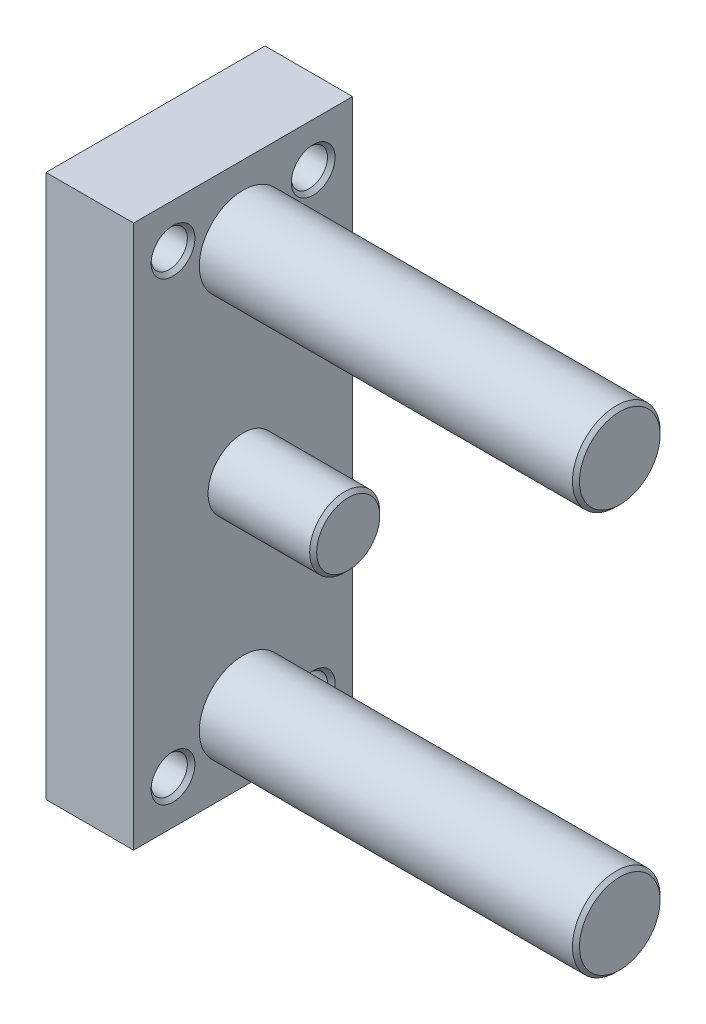
ISO-10303-21;
HEADER;
FILE_DESCRIPTION(('STEP AP214'),'2;1');
FILE_NAME('part.step','',(''),(''),'','','');
FILE_SCHEMA(('AUTOMOTIVE_DESIGN { 1 0 10303 214 1 1 1 1 }'));
ENDSEC;
DATA;
#1=APPLICATION_CONTEXT('core data for automotive mechanical design processes');
#2=APPLICATION_PROTOCOL_DEFINITION('international standard','automotive_design',2000,#1);
#3=PRODUCT_CONTEXT('',#1,'mechanical');
#4=PRODUCT('Part','Part','',(#3));
#5=PRODUCT_RELATED_PRODUCT_CATEGORY('part','',(#4));
#6=PRODUCT_DEFINITION_FORMATION('','',#4);
#7=PRODUCT_DEFINITION_CONTEXT('part definition',#1,'design');
#8=PRODUCT_DEFINITION('design','',#6,#7);
#9=PRODUCT_DEFINITION_SHAPE('','',#8);
#10=(LENGTH_UNIT() NAMED_UNIT(*) SI_UNIT(.MILLI.,.METRE.));
#11=(NAMED_UNIT(*) PLANE_ANGLE_UNIT() SI_UNIT($,.RADIAN.));
#12=(NAMED_UNIT(*) SI_UNIT($,.STERADIAN.) SOLID_ANGLE_UNIT());
#13=UNCERTAINTY_MEASURE_WITH_UNIT(LENGTH_MEASURE(1.E-05),#10,'distance_accuracy_value','');
#14=(GEOMETRIC_REPRESENTATION_CONTEXT(3) GLOBAL_UNCERTAINTY_ASSIGNED_CONTEXT((#13)) GLOBAL_UNIT_ASSIGNED_CONTEXT((#10,
#11,#12)) REPRESENTATION_CONTEXT('',''));
#15=CARTESIAN_POINT('',(0.,0.,0.));
#16=DIRECTION('',(0.,0.,1.));
#17=DIRECTION('',(1.,0.,0.));
#18=AXIS2_PLACEMENT_3D('',#15,#16,#17);
#19=CARTESIAN_POINT('',(10.,0.,0.));
#20=DIRECTION('',(1.,0.,0.));
#21=DIRECTION('',(0.,0.,-1.));
#22=AXIS2_PLACEMENT_3D('',#19,#20,#21);
#23=PLANE('',#22);
#24=CARTESIAN_POINT('',(10.,-23.,0.));
#25=DIRECTION('',(-1.,0.,0.));
#26=DIRECTION('',(0.,0.,1.));
#27=AXIS2_PLACEMENT_3D('',#24,#25,#26);
#28=CIRCLE('',#27,5.);
#29=CARTESIAN_POINT('',(10.,-23.,5.));
#30=VERTEX_POINT('',#29);
#31=EDGE_CURVE('E201',#30,#30,#28,.T.);
#32=ORIENTED_EDGE('',*,*,#31,.T.);
#33=EDGE_LOOP('',(#32));
#34=FACE_BOUND('',#33,.T.);
#35=CARTESIAN_POINT('',(10.,-26.,8.));
#36=DIRECTION('',(-1.,0.,0.));
#37=DIRECTION('',(0.,0.,1.));
#38=AXIS2_PLACEMENT_3D('',#35,#36,#37);
#39=CIRCLE('',#38,2.5);
#40=CARTESIAN_POINT('',(10.,-26.,10.5));
#41=VERTEX_POINT('',#40);
#42=EDGE_CURVE('E272',#41,#41,#39,.T.);
#43=ORIENTED_EDGE('',*,*,#42,.T.);
#44=EDGE_LOOP('',(#43));
#45=FACE_BOUND('',#44,.T.);
#46=CARTESIAN_POINT('',(10.,-26.,-7.99999999999999));
#47=DIRECTION('',(-1.,0.,0.));
#48=DIRECTION('',(0.,0.,1.));
#49=AXIS2_PLACEMENT_3D('',#46,#47,#48);
#50=CIRCLE('',#49,2.5);
#51=CARTESIAN_POINT('',(10.,-26.,-5.49999999999999));
#52=VERTEX_POINT('',#51);
#53=EDGE_CURVE('E294',#52,#52,#50,.T.);
#54=ORIENTED_EDGE('',*,*,#53,.T.);
#55=EDGE_LOOP('',(#54));
#56=FACE_BOUND('',#55,.T.);
#57=DIRECTION('',(0.,-1.,0.));
#58=VECTOR('',#57,1.);
#59=CARTESIAN_POINT('',(10.,31.,12.5));
#60=LINE('',#59,#58);
#61=CARTESIAN_POINT('',(10.,31.,12.5));
#62=VERTEX_POINT('',#61);
#63=CARTESIAN_POINT('',(10.,-31.,12.5));
#64=VERTEX_POINT('',#63);
#65=EDGE_CURVE('E150',#62,#64,#60,.T.);
#66=ORIENTED_EDGE('',*,*,#65,.T.);
#67=DIRECTION('',(0.,0.,-1.));
#68=VECTOR('',#67,1.);
#69=CARTESIAN_POINT('',(10.,-31.,12.5));
#70=LINE('',#69,#68);
#71=CARTESIAN_POINT('',(10.,-31.,-12.5));
#72=VERTEX_POINT('',#71);
#73=EDGE_CURVE('E85',#64,#72,#70,.T.);
#74=ORIENTED_EDGE('',*,*,#73,.T.);
#75=DIRECTION('',(0.,1.,0.));
#76=VECTOR('',#75,1.);
#77=CARTESIAN_POINT('',(10.,-31.,-12.5));
#78=LINE('',#77,#76);
#79=CARTESIAN_POINT('',(10.,31.,-12.5));
#80=VERTEX_POINT('',#79);
#81=EDGE_CURVE('E146',#72,#80,#78,.T.);
#82=ORIENTED_EDGE('',*,*,#81,.T.);
#83=DIRECTION('',(0.,0.,1.));
#84=VECTOR('',#83,1.);
#85=CARTESIAN_POINT('',(10.,31.,-12.5));
#86=LINE('',#85,#84);
#87=EDGE_CURVE('E54',#80,#62,#86,.T.);
#88=ORIENTED_EDGE('',*,*,#87,.T.);
#89=EDGE_LOOP('',(#66,#74,#82,#88));
#90=FACE_BOUND('',#89,.T.);
#91=CARTESIAN_POINT('',(10.,26.,-8.));
#92=DIRECTION('',(-1.,0.,0.));
#93=DIRECTION('',(0.,0.,1.));
#94=AXIS2_PLACEMENT_3D('',#91,#92,#93);
#95=CIRCLE('',#94,2.5);
#96=CARTESIAN_POINT('',(10.,26.,-5.5));
#97=VERTEX_POINT('',#96);
#98=EDGE_CURVE('E175',#97,#97,#95,.T.);
#99=ORIENTED_EDGE('',*,*,#98,.T.);
#100=EDGE_LOOP('',(#99));
#101=FACE_BOUND('',#100,.T.);
#102=CARTESIAN_POINT('',(10.,26.,7.99999999999999));
#103=DIRECTION('',(-1.,0.,0.));
#104=DIRECTION('',(0.,0.,1.));
#105=AXIS2_PLACEMENT_3D('',#102,#103,#104);
#106=CIRCLE('',#105,2.5);
#107=CARTESIAN_POINT('',(10.,26.,10.5));
#108=VERTEX_POINT('',#107);
#109=EDGE_CURVE('E179',#108,#108,#106,.T.);
#110=ORIENTED_EDGE('',*,*,#109,.T.);
#111=EDGE_LOOP('',(#110));
#112=FACE_BOUND('',#111,.T.);
#113=CARTESIAN_POINT('',(10.,0.,0.));
#114=DIRECTION('',(-1.,0.,0.));
#115=DIRECTION('',(0.,0.,1.));
#116=AXIS2_PLACEMENT_3D('',#113,#114,#115);
#117=CIRCLE('',#116,4.);
#118=CARTESIAN_POINT('',(10.,0.,4.));
#119=VERTEX_POINT('',#118);
#120=EDGE_CURVE('E183',#119,#119,#117,.T.);
#121=ORIENTED_EDGE('',*,*,#120,.T.);
#122=EDGE_LOOP('',(#121));
#123=FACE_BOUND('',#122,.T.);
#124=CARTESIAN_POINT('',(10.,23.,0.));
#125=DIRECTION('',(-1.,0.,0.));
#126=DIRECTION('',(0.,0.,1.));
#127=AXIS2_PLACEMENT_3D('',#124,#125,#126);
#128=CIRCLE('',#127,5.);
#129=CARTESIAN_POINT('',(10.,23.,5.));
#130=VERTEX_POINT('',#129);
#131=EDGE_CURVE('E186',#130,#130,#128,.T.);
#132=ORIENTED_EDGE('',*,*,#131,.T.);
#133=EDGE_LOOP('',(#132));
#134=FACE_BOUND('',#133,.T.);
#135=ADVANCED_FACE('F37',(#34,#45,#56,#90,#101,#112,#123,#134),#23,.T.);
#136=CARTESIAN_POINT('',(0.,0.,0.));
#137=DIRECTION('',(1.,0.,0.));
#138=DIRECTION('',(0.,0.,-1.));
#139=AXIS2_PLACEMENT_3D('',#136,#137,#138);
#140=PLANE('',#139);
#141=CARTESIAN_POINT('',(0.,0.,0.));
#142=DIRECTION('',(-1.,0.,0.));
#143=DIRECTION('',(0.,0.,1.));
#144=AXIS2_PLACEMENT_3D('',#141,#142,#143);
#145=CIRCLE('',#144,3.8);
#146=CARTESIAN_POINT('',(0.,0.,3.8));
#147=VERTEX_POINT('',#146);
#148=EDGE_CURVE('E248',#147,#147,#145,.T.);
#149=ORIENTED_EDGE('',*,*,#148,.F.);
#150=EDGE_LOOP('',(#149));
#151=FACE_BOUND('',#150,.T.);
#152=CARTESIAN_POINT('',(0.,-26.,8.));
#153=DIRECTION('',(-1.,0.,0.));
#154=DIRECTION('',(0.,0.,1.));
#155=AXIS2_PLACEMENT_3D('',#152,#153,#154);
#156=CIRCLE('',#155,2.5);
#157=CARTESIAN_POINT('',(0.,-26.,10.5));
#158=VERTEX_POINT('',#157);
#159=EDGE_CURVE('E281',#158,#158,#156,.T.);
#160=ORIENTED_EDGE('',*,*,#159,.F.);
#161=EDGE_LOOP('',(#160));
#162=FACE_BOUND('',#161,.T.);
#163=CARTESIAN_POINT('',(0.,-26.,-7.99999999999999));
#164=DIRECTION('',(-1.,0.,0.));
#165=DIRECTION('',(0.,0.,1.));
#166=AXIS2_PLACEMENT_3D('',#163,#164,#165);
#167=CIRCLE('',#166,2.5);
#168=CARTESIAN_POINT('',(0.,-26.,-5.49999999999999));
#169=VERTEX_POINT('',#168);
#170=EDGE_CURVE('E303',#169,#169,#167,.T.);
#171=ORIENTED_EDGE('',*,*,#170,.F.);
#172=EDGE_LOOP('',(#171));
#173=FACE_BOUND('',#172,.T.);
#174=DIRECTION('',(0.,-1.,0.));
#175=VECTOR('',#174,1.);
#176=CARTESIAN_POINT('',(0.,31.,12.5));
#177=LINE('',#176,#175);
#178=CARTESIAN_POINT('',(0.,31.,12.5));
#179=VERTEX_POINT('',#178);
#180=CARTESIAN_POINT('',(0.,-31.,12.5));
#181=VERTEX_POINT('',#180);
#182=EDGE_CURVE('E144',#179,#181,#177,.T.);
#183=ORIENTED_EDGE('',*,*,#182,.F.);
#184=DIRECTION('',(0.,0.,1.));
#185=VECTOR('',#184,1.);
#186=CARTESIAN_POINT('',(0.,31.,-12.5));
#187=LINE('',#186,#185);
#188=CARTESIAN_POINT('',(0.,31.,-12.5));
#189=VERTEX_POINT('',#188);
#190=EDGE_CURVE('E78',#189,#179,#187,.T.);
#191=ORIENTED_EDGE('',*,*,#190,.F.);
#192=DIRECTION('',(0.,1.,0.));
#193=VECTOR('',#192,1.);
#194=CARTESIAN_POINT('',(0.,-31.,-12.5));
#195=LINE('',#194,#193);
#196=CARTESIAN_POINT('',(0.,-31.,-12.5));
#197=VERTEX_POINT('',#196);
#198=EDGE_CURVE('E72',#197,#189,#195,.T.);
#199=ORIENTED_EDGE('',*,*,#198,.F.);
#200=DIRECTION('',(0.,0.,-1.));
#201=VECTOR('',#200,1.);
#202=CARTESIAN_POINT('',(0.,-31.,12.5));
#203=LINE('',#202,#201);
#204=EDGE_CURVE('E138',#181,#197,#203,.T.);
#205=ORIENTED_EDGE('',*,*,#204,.F.);
#206=EDGE_LOOP('',(#183,#191,#199,#205));
#207=FACE_BOUND('',#206,.T.);
#208=CARTESIAN_POINT('',(0.,26.,-8.));
#209=DIRECTION('',(-1.,0.,0.));
#210=DIRECTION('',(0.,0.,1.));
#211=AXIS2_PLACEMENT_3D('',#208,#209,#210);
#212=CIRCLE('',#211,2.5);
#213=CARTESIAN_POINT('',(0.,26.,-5.5));
#214=VERTEX_POINT('',#213);
#215=EDGE_CURVE('E160',#214,#214,#212,.T.);
#216=ORIENTED_EDGE('',*,*,#215,.F.);
#217=EDGE_LOOP('',(#216));
#218=FACE_BOUND('',#217,.T.);
#219=CARTESIAN_POINT('',(0.,26.,7.99999999999999));
#220=DIRECTION('',(-1.,0.,0.));
#221=DIRECTION('',(0.,0.,1.));
#222=AXIS2_PLACEMENT_3D('',#219,#220,#221);
#223=CIRCLE('',#222,2.5);
#224=CARTESIAN_POINT('',(0.,26.,10.5));
#225=VERTEX_POINT('',#224);
#226=EDGE_CURVE('E291',#225,#225,#223,.T.);
#227=ORIENTED_EDGE('',*,*,#226,.F.);
#228=EDGE_LOOP('',(#227));
#229=FACE_BOUND('',#228,.T.);
#230=CARTESIAN_POINT('',(0.,23.,0.));
#231=DIRECTION('',(-1.,0.,0.));
#232=DIRECTION('',(0.,0.,1.));
#233=AXIS2_PLACEMENT_3D('',#230,#231,#232);
#234=CIRCLE('',#233,3.8);
#235=CARTESIAN_POINT('',(0.,23.,3.8));
#236=VERTEX_POINT('',#235);
#237=EDGE_CURVE('E269',#236,#236,#234,.T.);
#238=ORIENTED_EDGE('',*,*,#237,.F.);
#239=EDGE_LOOP('',(#238));
#240=FACE_BOUND('',#239,.T.);
#241=CARTESIAN_POINT('',(0.,-23.,0.));
#242=DIRECTION('',(-1.,0.,0.));
#243=DIRECTION('',(0.,0.,1.));
#244=AXIS2_PLACEMENT_3D('',#241,#242,#243);
#245=CIRCLE('',#244,3.8);
#246=CARTESIAN_POINT('',(0.,-23.,3.8));
#247=VERTEX_POINT('',#246);
#248=EDGE_CURVE('E227',#247,#247,#245,.T.);
#249=ORIENTED_EDGE('',*,*,#248,.F.);
#250=EDGE_LOOP('',(#249));
#251=FACE_BOUND('',#250,.T.);
#252=ADVANCED_FACE('F113',(#151,#162,#173,#207,#218,#229,#240,#251),#140,.F.);
#253=CARTESIAN_POINT('',(10.,31.,12.5));
#254=DIRECTION('',(0.,0.,-1.));
#255=DIRECTION('',(-1.,0.,0.));
#256=AXIS2_PLACEMENT_3D('',#253,#254,#255);
#257=PLANE('',#256);
#258=ORIENTED_EDGE('',*,*,#182,.T.);
#259=DIRECTION('',(-1.,0.,0.));
#260=VECTOR('',#259,1.);
#261=CARTESIAN_POINT('',(10.,-31.,12.5));
#262=LINE('',#261,#260);
#263=EDGE_CURVE('E11',#64,#181,#262,.T.);
#264=ORIENTED_EDGE('',*,*,#263,.F.);
#265=ORIENTED_EDGE('',*,*,#65,.F.);
#266=DIRECTION('',(-1.,0.,0.));
#267=VECTOR('',#266,1.);
#268=CARTESIAN_POINT('',(10.,31.,12.5));
#269=LINE('',#268,#267);
#270=EDGE_CURVE('E154',#62,#179,#269,.T.);
#271=ORIENTED_EDGE('',*,*,#270,.T.);
#272=EDGE_LOOP('',(#258,#264,#265,#271));
#273=FACE_BOUND('',#272,.T.);
#274=ADVANCED_FACE('F39',(#273),#257,.F.);
#275=CARTESIAN_POINT('',(10.,-31.,12.5));
#276=DIRECTION('',(0.,1.,0.));
#277=DIRECTION('',(0.,0.,1.));
#278=AXIS2_PLACEMENT_3D('',#275,#276,#277);
#279=PLANE('',#278);
#280=ORIENTED_EDGE('',*,*,#204,.T.);
#281=DIRECTION('',(-1.,0.,0.));
#282=VECTOR('',#281,1.);
#283=CARTESIAN_POINT('',(10.,-31.,-12.5));
#284=LINE('',#283,#282);
#285=EDGE_CURVE('E46',#72,#197,#284,.T.);
#286=ORIENTED_EDGE('',*,*,#285,.F.);
#287=ORIENTED_EDGE('',*,*,#73,.F.);
#288=ORIENTED_EDGE('',*,*,#263,.T.);
#289=EDGE_LOOP('',(#280,#286,#287,#288));
#290=FACE_BOUND('',#289,.T.);
#291=ADVANCED_FACE('F132',(#290),#279,.F.);
#292=CARTESIAN_POINT('',(10.,-31.,-12.5));
#293=DIRECTION('',(0.,0.,1.));
#294=DIRECTION('',(1.,0.,0.));
#295=AXIS2_PLACEMENT_3D('',#292,#293,#294);
#296=PLANE('',#295);
#297=ORIENTED_EDGE('',*,*,#198,.T.);
#298=DIRECTION('',(-1.,0.,0.));
#299=VECTOR('',#298,1.);
#300=CARTESIAN_POINT('',(10.,31.,-12.5));
#301=LINE('',#300,#299);
#302=EDGE_CURVE('E147',#80,#189,#301,.T.);
#303=ORIENTED_EDGE('',*,*,#302,.F.);
#304=ORIENTED_EDGE('',*,*,#81,.F.);
#305=ORIENTED_EDGE('',*,*,#285,.T.);
#306=EDGE_LOOP('',(#297,#303,#304,#305));
#307=FACE_BOUND('',#306,.T.);
#308=ADVANCED_FACE('F130',(#307),#296,.F.);
#309=CARTESIAN_POINT('',(10.,31.,-12.5));
#310=DIRECTION('',(0.,-1.,0.));
#311=DIRECTION('',(0.,0.,-1.));
#312=AXIS2_PLACEMENT_3D('',#309,#310,#311);
#313=PLANE('',#312);
#314=ORIENTED_EDGE('',*,*,#190,.T.);
#315=ORIENTED_EDGE('',*,*,#270,.F.);
#316=ORIENTED_EDGE('',*,*,#87,.F.);
#317=ORIENTED_EDGE('',*,*,#302,.T.);
#318=EDGE_LOOP('',(#314,#315,#316,#317));
#319=FACE_BOUND('',#318,.T.);
#320=ADVANCED_FACE('F127',(#319),#313,.F.);
#321=CARTESIAN_POINT('',(0.432999999999999,26.,-8.));
#322=DIRECTION('',(-1.,0.,0.));
#323=DIRECTION('',(0.,0.,1.));
#324=AXIS2_PLACEMENT_3D('',#321,#322,#323);
#325=CONICAL_SURFACE('',#324,2.067,0.78539816339745);
#326=ORIENTED_EDGE('',*,*,#215,.T.);
#327=EDGE_LOOP('',(#326));
#328=FACE_BOUND('',#327,.T.);
#329=CARTESIAN_POINT('',(0.432999999999999,26.,-8.));
#330=DIRECTION('',(-1.,0.,0.));
#331=DIRECTION('',(0.,0.,1.));
#332=AXIS2_PLACEMENT_3D('',#329,#330,#331);
#333=CIRCLE('',#332,2.067);
#334=CARTESIAN_POINT('',(0.432999999999999,26.,-5.933));
#335=VERTEX_POINT('',#334);
#336=EDGE_CURVE('E162',#335,#335,#333,.T.);
#337=ORIENTED_EDGE('',*,*,#336,.F.);
#338=EDGE_LOOP('',(#337));
#339=FACE_BOUND('',#338,.T.);
#340=ADVANCED_FACE('F124',(#328,#339),#325,.F.);
#341=CARTESIAN_POINT('',(10.,26.,-8.));
#342=DIRECTION('',(-1.,0.,0.));
#343=DIRECTION('',(0.,0.,1.));
#344=AXIS2_PLACEMENT_3D('',#341,#342,#343);
#345=CYLINDRICAL_SURFACE('',#344,2.067);
#346=ORIENTED_EDGE('',*,*,#336,.T.);
#347=EDGE_LOOP('',(#346));
#348=FACE_BOUND('',#347,.T.);
#349=CARTESIAN_POINT('',(9.567,26.,-8.));
#350=DIRECTION('',(-1.,0.,0.));
#351=DIRECTION('',(0.,0.,1.));
#352=AXIS2_PLACEMENT_3D('',#349,#350,#351);
#353=CIRCLE('',#352,2.067);
#354=CARTESIAN_POINT('',(9.567,26.,-5.933));
#355=VERTEX_POINT('',#354);
#356=EDGE_CURVE('E167',#355,#355,#353,.T.);
#357=ORIENTED_EDGE('',*,*,#356,.F.);
#358=EDGE_LOOP('',(#357));
#359=FACE_BOUND('',#358,.T.);
#360=ADVANCED_FACE('F312',(#348,#359),#345,.F.);
#361=CARTESIAN_POINT('',(10.,26.,-8.));
#362=DIRECTION('',(1.,0.,0.));
#363=DIRECTION('',(0.,0.,-1.));
#364=AXIS2_PLACEMENT_3D('',#361,#362,#363);
#365=CONICAL_SURFACE('',#364,2.5,0.78539816339745);
#366=ORIENTED_EDGE('',*,*,#356,.T.);
#367=EDGE_LOOP('',(#366));
#368=FACE_BOUND('',#367,.T.);
#369=ORIENTED_EDGE('',*,*,#98,.F.);
#370=EDGE_LOOP('',(#369));
#371=FACE_BOUND('',#370,.T.);
#372=ADVANCED_FACE('F309',(#368,#371),#365,.F.);
#373=CARTESIAN_POINT('',(0.432999999999999,-26.,-7.99999999999999));
#374=DIRECTION('',(-1.,0.,0.));
#375=DIRECTION('',(0.,0.,1.));
#376=AXIS2_PLACEMENT_3D('',#373,#374,#375);
#377=CONICAL_SURFACE('',#376,2.067,0.78539816339745);
#378=ORIENTED_EDGE('',*,*,#170,.T.);
#379=EDGE_LOOP('',(#378));
#380=FACE_BOUND('',#379,.T.);
#381=CARTESIAN_POINT('',(0.432999999999999,-26.,-7.99999999999999));
#382=DIRECTION('',(-1.,0.,0.));
#383=DIRECTION('',(0.,0.,1.));
#384=AXIS2_PLACEMENT_3D('',#381,#382,#383);
#385=CIRCLE('',#384,2.067);
#386=CARTESIAN_POINT('',(0.432999999999999,-26.,-5.93299999999999));
#387=VERTEX_POINT('',#386);
#388=EDGE_CURVE('E300',#387,#387,#385,.T.);
#389=ORIENTED_EDGE('',*,*,#388,.F.);
#390=EDGE_LOOP('',(#389));
#391=FACE_BOUND('',#390,.T.);
#392=ADVANCED_FACE('F319',(#380,#391),#377,.F.);
#393=CARTESIAN_POINT('',(10.,-26.,-7.99999999999999));
#394=DIRECTION('',(-1.,0.,0.));
#395=DIRECTION('',(0.,0.,1.));
#396=AXIS2_PLACEMENT_3D('',#393,#394,#395);
#397=CYLINDRICAL_SURFACE('',#396,2.067);
#398=ORIENTED_EDGE('',*,*,#388,.T.);
#399=EDGE_LOOP('',(#398));
#400=FACE_BOUND('',#399,.T.);
#401=CARTESIAN_POINT('',(9.567,-26.,-7.99999999999999));
#402=DIRECTION('',(-1.,0.,0.));
#403=DIRECTION('',(0.,0.,1.));
#404=AXIS2_PLACEMENT_3D('',#401,#402,#403);
#405=CIRCLE('',#404,2.067);
#406=CARTESIAN_POINT('',(9.567,-26.,-5.93299999999999));
#407=VERTEX_POINT('',#406);
#408=EDGE_CURVE('E297',#407,#407,#405,.T.);
#409=ORIENTED_EDGE('',*,*,#408,.F.);
#410=EDGE_LOOP('',(#409));
#411=FACE_BOUND('',#410,.T.);
#412=ADVANCED_FACE('F324',(#400,#411),#397,.F.);
#413=CARTESIAN_POINT('',(10.,-26.,-7.99999999999999));
#414=DIRECTION('',(1.,0.,0.));
#415=DIRECTION('',(0.,0.,-1.));
#416=AXIS2_PLACEMENT_3D('',#413,#414,#415);
#417=CONICAL_SURFACE('',#416,2.5,0.78539816339745);
#418=ORIENTED_EDGE('',*,*,#408,.T.);
#419=EDGE_LOOP('',(#418));
#420=FACE_BOUND('',#419,.T.);
#421=ORIENTED_EDGE('',*,*,#53,.F.);
#422=EDGE_LOOP('',(#421));
#423=FACE_BOUND('',#422,.T.);
#424=ADVANCED_FACE('F328',(#420,#423),#417,.F.);
#425=CARTESIAN_POINT('',(0.432999999999999,26.,7.99999999999999));
#426=DIRECTION('',(-1.,0.,0.));
#427=DIRECTION('',(0.,0.,1.));
#428=AXIS2_PLACEMENT_3D('',#425,#426,#427);
#429=CONICAL_SURFACE('',#428,2.067,0.78539816339745);
#430=ORIENTED_EDGE('',*,*,#226,.T.);
#431=EDGE_LOOP('',(#430));
#432=FACE_BOUND('',#431,.T.);
#433=CARTESIAN_POINT('',(0.432999999999999,26.,7.99999999999999));
#434=DIRECTION('',(-1.,0.,0.));
#435=DIRECTION('',(0.,0.,1.));
#436=AXIS2_PLACEMENT_3D('',#433,#434,#435);
#437=CIRCLE('',#436,2.067);
#438=CARTESIAN_POINT('',(0.432999999999999,26.,10.067));
#439=VERTEX_POINT('',#438);
#440=EDGE_CURVE('E288',#439,#439,#437,.T.);
#441=ORIENTED_EDGE('',*,*,#440,.F.);
#442=EDGE_LOOP('',(#441));
#443=FACE_BOUND('',#442,.T.);
#444=ADVANCED_FACE('F332',(#432,#443),#429,.F.);
#445=CARTESIAN_POINT('',(10.,26.,7.99999999999999));
#446=DIRECTION('',(-1.,0.,0.));
#447=DIRECTION('',(0.,0.,1.));
#448=AXIS2_PLACEMENT_3D('',#445,#446,#447);
#449=CYLINDRICAL_SURFACE('',#448,2.067);
#450=ORIENTED_EDGE('',*,*,#440,.T.);
#451=EDGE_LOOP('',(#450));
#452=FACE_BOUND('',#451,.T.);
#453=CARTESIAN_POINT('',(9.567,26.,7.99999999999999));
#454=DIRECTION('',(-1.,0.,0.));
#455=DIRECTION('',(0.,0.,1.));
#456=AXIS2_PLACEMENT_3D('',#453,#454,#455);
#457=CIRCLE('',#456,2.067);
#458=CARTESIAN_POINT('',(9.567,26.,10.067));
#459=VERTEX_POINT('',#458);
#460=EDGE_CURVE('E285',#459,#459,#457,.T.);
#461=ORIENTED_EDGE('',*,*,#460,.F.);
#462=EDGE_LOOP('',(#461));
#463=FACE_BOUND('',#462,.T.);
#464=ADVANCED_FACE('F336',(#452,#463),#449,.F.);
#465=CARTESIAN_POINT('',(10.,26.,7.99999999999999));
#466=DIRECTION('',(1.,0.,0.));
#467=DIRECTION('',(0.,0.,-1.));
#468=AXIS2_PLACEMENT_3D('',#465,#466,#467);
#469=CONICAL_SURFACE('',#468,2.5,0.78539816339745);
#470=ORIENTED_EDGE('',*,*,#460,.T.);
#471=EDGE_LOOP('',(#470));
#472=FACE_BOUND('',#471,.T.);
#473=ORIENTED_EDGE('',*,*,#109,.F.);
#474=EDGE_LOOP('',(#473));
#475=FACE_BOUND('',#474,.T.);
#476=ADVANCED_FACE('F340',(#472,#475),#469,.F.);
#477=CARTESIAN_POINT('',(0.432999999999999,-26.,8.));
#478=DIRECTION('',(-1.,0.,0.));
#479=DIRECTION('',(0.,0.,1.));
#480=AXIS2_PLACEMENT_3D('',#477,#478,#479);
#481=CONICAL_SURFACE('',#480,2.067,0.78539816339745);
#482=ORIENTED_EDGE('',*,*,#159,.T.);
#483=EDGE_LOOP('',(#482));
#484=FACE_BOUND('',#483,.T.);
#485=CARTESIAN_POINT('',(0.432999999999999,-26.,8.));
#486=DIRECTION('',(-1.,0.,0.));
#487=DIRECTION('',(0.,0.,1.));
#488=AXIS2_PLACEMENT_3D('',#485,#486,#487);
#489=CIRCLE('',#488,2.067);
#490=CARTESIAN_POINT('',(0.432999999999999,-26.,10.067));
#491=VERTEX_POINT('',#490);
#492=EDGE_CURVE('E278',#491,#491,#489,.T.);
#493=ORIENTED_EDGE('',*,*,#492,.F.);
#494=EDGE_LOOP('',(#493));
#495=FACE_BOUND('',#494,.T.);
#496=ADVANCED_FACE('F344',(#484,#495),#481,.F.);
#497=CARTESIAN_POINT('',(10.,-26.,8.));
#498=DIRECTION('',(-1.,0.,0.));
#499=DIRECTION('',(0.,0.,1.));
#500=AXIS2_PLACEMENT_3D('',#497,#498,#499);
#501=CYLINDRICAL_SURFACE('',#500,2.067);
#502=ORIENTED_EDGE('',*,*,#492,.T.);
#503=EDGE_LOOP('',(#502));
#504=FACE_BOUND('',#503,.T.);
#505=CARTESIAN_POINT('',(9.567,-26.,8.));
#506=DIRECTION('',(-1.,0.,0.));
#507=DIRECTION('',(0.,0.,1.));
#508=AXIS2_PLACEMENT_3D('',#505,#506,#507);
#509=CIRCLE('',#508,2.067);
#510=CARTESIAN_POINT('',(9.567,-26.,10.067));
#511=VERTEX_POINT('',#510);
#512=EDGE_CURVE('E275',#511,#511,#509,.T.);
#513=ORIENTED_EDGE('',*,*,#512,.F.);
#514=EDGE_LOOP('',(#513));
#515=FACE_BOUND('',#514,.T.);
#516=ADVANCED_FACE('F348',(#504,#515),#501,.F.);
#517=CARTESIAN_POINT('',(10.,-26.,8.));
#518=DIRECTION('',(1.,0.,0.));
#519=DIRECTION('',(0.,0.,-1.));
#520=AXIS2_PLACEMENT_3D('',#517,#518,#519);
#521=CONICAL_SURFACE('',#520,2.5,0.78539816339745);
#522=ORIENTED_EDGE('',*,*,#512,.T.);
#523=EDGE_LOOP('',(#522));
#524=FACE_BOUND('',#523,.T.);
#525=ORIENTED_EDGE('',*,*,#42,.F.);
#526=EDGE_LOOP('',(#525));
#527=FACE_BOUND('',#526,.T.);
#528=ADVANCED_FACE('F352',(#524,#527),#521,.F.);
#529=CARTESIAN_POINT('',(5.02158095933999,23.,0.));
#530=DIRECTION('',(-1.,0.,0.));
#531=DIRECTION('',(0.,0.,1.));
#532=AXIS2_PLACEMENT_3D('',#529,#530,#531);
#533=CYLINDRICAL_SURFACE('',#532,3.8);
#534=ORIENTED_EDGE('',*,*,#237,.T.);
#535=EDGE_LOOP('',(#534));
#536=FACE_BOUND('',#535,.T.);
#537=CARTESIAN_POINT('',(5.55555555555556,23.,0.));
#538=DIRECTION('',(-1.,0.,0.));
#539=DIRECTION('',(0.,0.,1.));
#540=AXIS2_PLACEMENT_3D('',#537,#538,#539);
#541=CIRCLE('',#540,3.8);
#542=CARTESIAN_POINT('',(5.55555555555556,23.,3.8));
#543=VERTEX_POINT('',#542);
#544=EDGE_CURVE('E266',#543,#543,#541,.T.);
#545=ORIENTED_EDGE('',*,*,#544,.F.);
#546=EDGE_LOOP('',(#545));
#547=FACE_BOUND('',#546,.T.);
#548=ADVANCED_FACE('F356',(#536,#547),#533,.F.);
#549=CARTESIAN_POINT('',(5.55555555555556,23.,-3.8));
#550=DIRECTION('',(-1.,0.,0.));
#551=DIRECTION('',(0.,0.,1.));
#552=AXIS2_PLACEMENT_3D('',#549,#550,#551);
#553=PLANE('',#552);
#554=ORIENTED_EDGE('',*,*,#544,.T.);
#555=EDGE_LOOP('',(#554));
#556=FACE_BOUND('',#555,.T.);
#557=CARTESIAN_POINT('',(5.55555555555556,23.,0.));
#558=DIRECTION('',(-1.,0.,0.));
#559=DIRECTION('',(0.,0.,1.));
#560=AXIS2_PLACEMENT_3D('',#557,#558,#559);
#561=CIRCLE('',#560,3.5);
#562=CARTESIAN_POINT('',(5.55555555555556,23.,3.5));
#563=VERTEX_POINT('',#562);
#564=EDGE_CURVE('E263',#563,#563,#561,.T.);
#565=ORIENTED_EDGE('',*,*,#564,.F.);
#566=EDGE_LOOP('',(#565));
#567=FACE_BOUND('',#566,.T.);
#568=ADVANCED_FACE('F360',(#556,#567),#553,.T.);
#569=CARTESIAN_POINT('',(5.02158095933999,23.,0.));
#570=DIRECTION('',(-1.,0.,0.));
#571=DIRECTION('',(0.,0.,1.));
#572=AXIS2_PLACEMENT_3D('',#569,#570,#571);
#573=CYLINDRICAL_SURFACE('',#572,3.5);
#574=ORIENTED_EDGE('',*,*,#564,.T.);
#575=EDGE_LOOP('',(#574));
#576=FACE_BOUND('',#575,.T.);
#577=CARTESIAN_POINT('',(2.05555555555556,23.,0.));
#578=DIRECTION('',(-1.,0.,0.));
#579=DIRECTION('',(0.,0.,1.));
#580=AXIS2_PLACEMENT_3D('',#577,#578,#579);
#581=CIRCLE('',#580,3.5);
#582=CARTESIAN_POINT('',(2.05555555555556,23.,3.5));
#583=VERTEX_POINT('',#582);
#584=EDGE_CURVE('E260',#583,#583,#581,.T.);
#585=ORIENTED_EDGE('',*,*,#584,.F.);
#586=EDGE_LOOP('',(#585));
#587=FACE_BOUND('',#586,.T.);
#588=ADVANCED_FACE('F364',(#576,#587),#573,.T.);
#589=CARTESIAN_POINT('',(1.55555555555556,23.,0.));
#590=DIRECTION('',(1.,0.,0.));
#591=DIRECTION('',(0.,0.,-1.));
#592=AXIS2_PLACEMENT_3D('',#589,#590,#591);
#593=CONICAL_SURFACE('',#592,3.,0.785398163397449);
#594=ORIENTED_EDGE('',*,*,#584,.T.);
#595=EDGE_LOOP('',(#594));
#596=FACE_BOUND('',#595,.T.);
#597=CARTESIAN_POINT('',(1.55555555555556,23.,0.));
#598=DIRECTION('',(-1.,0.,0.));
#599=DIRECTION('',(0.,0.,1.));
#600=AXIS2_PLACEMENT_3D('',#597,#598,#599);
#601=CIRCLE('',#600,3.);
#602=CARTESIAN_POINT('',(1.55555555555556,23.,3.));
#603=VERTEX_POINT('',#602);
#604=EDGE_CURVE('E257',#603,#603,#601,.T.);
#605=ORIENTED_EDGE('',*,*,#604,.F.);
#606=EDGE_LOOP('',(#605));
#607=FACE_BOUND('',#606,.T.);
#608=ADVANCED_FACE('F368',(#596,#607),#593,.T.);
#609=CARTESIAN_POINT('',(1.55555555555556,23.,-3.));
#610=DIRECTION('',(-1.,0.,0.));
#611=DIRECTION('',(0.,0.,1.));
#612=AXIS2_PLACEMENT_3D('',#609,#610,#611);
#613=PLANE('',#612);
#614=ORIENTED_EDGE('',*,*,#604,.T.);
#615=EDGE_LOOP('',(#614));
#616=FACE_BOUND('',#615,.T.);
#617=CARTESIAN_POINT('',(1.55555555555556,23.,0.));
#618=DIRECTION('',(-1.,0.,0.));
#619=DIRECTION('',(0.,0.,1.));
#620=AXIS2_PLACEMENT_3D('',#617,#618,#619);
#621=CIRCLE('',#620,1.5);
#622=CARTESIAN_POINT('',(1.55555555555556,23.,1.5));
#623=VERTEX_POINT('',#622);
#624=EDGE_CURVE('E254',#623,#623,#621,.T.);
#625=ORIENTED_EDGE('',*,*,#624,.F.);
#626=EDGE_LOOP('',(#625));
#627=FACE_BOUND('',#626,.T.);
#628=ADVANCED_FACE('F372',(#616,#627),#613,.T.);
#629=CARTESIAN_POINT('',(5.02158095933999,23.,0.));
#630=DIRECTION('',(-1.,0.,0.));
#631=DIRECTION('',(0.,0.,1.));
#632=AXIS2_PLACEMENT_3D('',#629,#630,#631);
#633=CYLINDRICAL_SURFACE('',#632,1.5);
#634=ORIENTED_EDGE('',*,*,#624,.T.);
#635=EDGE_LOOP('',(#634));
#636=FACE_BOUND('',#635,.T.);
#637=CARTESIAN_POINT('',(4.15555555555556,23.,0.));
#638=DIRECTION('',(-1.,0.,0.));
#639=DIRECTION('',(0.,0.,1.));
#640=AXIS2_PLACEMENT_3D('',#637,#638,#639);
#641=CIRCLE('',#640,1.5);
#642=CARTESIAN_POINT('',(4.15555555555556,23.,1.5));
#643=VERTEX_POINT('',#642);
#644=EDGE_CURVE('E251',#643,#643,#641,.T.);
#645=ORIENTED_EDGE('',*,*,#644,.F.);
#646=EDGE_LOOP('',(#645));
#647=FACE_BOUND('',#646,.T.);
#648=ADVANCED_FACE('F376',(#636,#647),#633,.F.);
#649=CARTESIAN_POINT('',(5.02158095933999,23.,0.));
#650=DIRECTION('',(-1.,0.,0.));
#651=DIRECTION('',(0.,0.,1.));
#652=AXIS2_PLACEMENT_3D('',#649,#650,#651);
#653=CONICAL_SURFACE('',#652,0.,1.0471975511966);
#654=ORIENTED_EDGE('',*,*,#644,.T.);
#655=EDGE_LOOP('',(#654));
#656=FACE_BOUND('',#655,.T.);
#657=CARTESIAN_POINT('',(5.02158095933999,23.,0.));
#658=VERTEX_POINT('',#657);
#659=VERTEX_LOOP('',#658);
#660=FACE_BOUND('',#659,.T.);
#661=ADVANCED_FACE('F380',(#656,#660),#653,.F.);
#662=CARTESIAN_POINT('',(5.02158095933999,0.,0.));
#663=DIRECTION('',(-1.,0.,0.));
#664=DIRECTION('',(0.,0.,1.));
#665=AXIS2_PLACEMENT_3D('',#662,#663,#664);
#666=CYLINDRICAL_SURFACE('',#665,3.8);
#667=ORIENTED_EDGE('',*,*,#148,.T.);
#668=EDGE_LOOP('',(#667));
#669=FACE_BOUND('',#668,.T.);
#670=CARTESIAN_POINT('',(5.55555555555556,0.,0.));
#671=DIRECTION('',(-1.,0.,0.));
#672=DIRECTION('',(0.,0.,1.));
#673=AXIS2_PLACEMENT_3D('',#670,#671,#672);
#674=CIRCLE('',#673,3.8);
#675=CARTESIAN_POINT('',(5.55555555555556,0.,3.8));
#676=VERTEX_POINT('',#675);
#677=EDGE_CURVE('E245',#676,#676,#674,.T.);
#678=ORIENTED_EDGE('',*,*,#677,.F.);
#679=EDGE_LOOP('',(#678));
#680=FACE_BOUND('',#679,.T.);
#681=ADVANCED_FACE('F384',(#669,#680),#666,.F.);
#682=CARTESIAN_POINT('',(5.55555555555556,0.,-3.8));
#683=DIRECTION('',(-1.,0.,0.));
#684=DIRECTION('',(0.,0.,1.));
#685=AXIS2_PLACEMENT_3D('',#682,#683,#684);
#686=PLANE('',#685);
#687=ORIENTED_EDGE('',*,*,#677,.T.);
#688=EDGE_LOOP('',(#687));
#689=FACE_BOUND('',#688,.T.);
#690=CARTESIAN_POINT('',(5.55555555555556,0.,0.));
#691=DIRECTION('',(-1.,0.,0.));
#692=DIRECTION('',(0.,0.,1.));
#693=AXIS2_PLACEMENT_3D('',#690,#691,#692);
#694=CIRCLE('',#693,3.5);
#695=CARTESIAN_POINT('',(5.55555555555556,0.,3.5));
#696=VERTEX_POINT('',#695);
#697=EDGE_CURVE('E242',#696,#696,#694,.T.);
#698=ORIENTED_EDGE('',*,*,#697,.F.);
#699=EDGE_LOOP('',(#698));
#700=FACE_BOUND('',#699,.T.);
#701=ADVANCED_FACE('F388',(#689,#700),#686,.T.);
#702=CARTESIAN_POINT('',(5.02158095933999,0.,0.));
#703=DIRECTION('',(-1.,0.,0.));
#704=DIRECTION('',(0.,0.,1.));
#705=AXIS2_PLACEMENT_3D('',#702,#703,#704);
#706=CYLINDRICAL_SURFACE('',#705,3.5);
#707=ORIENTED_EDGE('',*,*,#697,.T.);
#708=EDGE_LOOP('',(#707));
#709=FACE_BOUND('',#708,.T.);
#710=CARTESIAN_POINT('',(2.05555555555556,0.,0.));
#711=DIRECTION('',(-1.,0.,0.));
#712=DIRECTION('',(0.,0.,1.));
#713=AXIS2_PLACEMENT_3D('',#710,#711,#712);
#714=CIRCLE('',#713,3.5);
#715=CARTESIAN_POINT('',(2.05555555555556,0.,3.5));
#716=VERTEX_POINT('',#715);
#717=EDGE_CURVE('E239',#716,#716,#714,.T.);
#718=ORIENTED_EDGE('',*,*,#717,.F.);
#719=EDGE_LOOP('',(#718));
#720=FACE_BOUND('',#719,.T.);
#721=ADVANCED_FACE('F392',(#709,#720),#706,.T.);
#722=CARTESIAN_POINT('',(1.55555555555556,0.,0.));
#723=DIRECTION('',(1.,0.,0.));
#724=DIRECTION('',(0.,0.,-1.));
#725=AXIS2_PLACEMENT_3D('',#722,#723,#724);
#726=CONICAL_SURFACE('',#725,3.,0.785398163397449);
#727=ORIENTED_EDGE('',*,*,#717,.T.);
#728=EDGE_LOOP('',(#727));
#729=FACE_BOUND('',#728,.T.);
#730=CARTESIAN_POINT('',(1.55555555555556,0.,0.));
#731=DIRECTION('',(-1.,0.,0.));
#732=DIRECTION('',(0.,0.,1.));
#733=AXIS2_PLACEMENT_3D('',#730,#731,#732);
#734=CIRCLE('',#733,3.);
#735=CARTESIAN_POINT('',(1.55555555555556,0.,3.));
#736=VERTEX_POINT('',#735);
#737=EDGE_CURVE('E236',#736,#736,#734,.T.);
#738=ORIENTED_EDGE('',*,*,#737,.F.);
#739=EDGE_LOOP('',(#738));
#740=FACE_BOUND('',#739,.T.);
#741=ADVANCED_FACE('F396',(#729,#740),#726,.T.);
#742=CARTESIAN_POINT('',(1.55555555555556,0.,-3.));
#743=DIRECTION('',(-1.,0.,0.));
#744=DIRECTION('',(0.,0.,1.));
#745=AXIS2_PLACEMENT_3D('',#742,#743,#744);
#746=PLANE('',#745);
#747=ORIENTED_EDGE('',*,*,#737,.T.);
#748=EDGE_LOOP('',(#747));
#749=FACE_BOUND('',#748,.T.);
#750=CARTESIAN_POINT('',(1.55555555555556,0.,0.));
#751=DIRECTION('',(-1.,0.,0.));
#752=DIRECTION('',(0.,0.,1.));
#753=AXIS2_PLACEMENT_3D('',#750,#751,#752);
#754=CIRCLE('',#753,1.5);
#755=CARTESIAN_POINT('',(1.55555555555556,0.,1.5));
#756=VERTEX_POINT('',#755);
#757=EDGE_CURVE('E233',#756,#756,#754,.T.);
#758=ORIENTED_EDGE('',*,*,#757,.F.);
#759=EDGE_LOOP('',(#758));
#760=FACE_BOUND('',#759,.T.);
#761=ADVANCED_FACE('F400',(#749,#760),#746,.T.);
#762=CARTESIAN_POINT('',(5.02158095933999,0.,0.));
#763=DIRECTION('',(-1.,0.,0.));
#764=DIRECTION('',(0.,0.,1.));
#765=AXIS2_PLACEMENT_3D('',#762,#763,#764);
#766=CYLINDRICAL_SURFACE('',#765,1.5);
#767=ORIENTED_EDGE('',*,*,#757,.T.);
#768=EDGE_LOOP('',(#767));
#769=FACE_BOUND('',#768,.T.);
#770=CARTESIAN_POINT('',(4.15555555555556,0.,0.));
#771=DIRECTION('',(-1.,0.,0.));
#772=DIRECTION('',(0.,0.,1.));
#773=AXIS2_PLACEMENT_3D('',#770,#771,#772);
#774=CIRCLE('',#773,1.5);
#775=CARTESIAN_POINT('',(4.15555555555556,0.,1.5));
#776=VERTEX_POINT('',#775);
#777=EDGE_CURVE('E230',#776,#776,#774,.T.);
#778=ORIENTED_EDGE('',*,*,#777,.F.);
#779=EDGE_LOOP('',(#778));
#780=FACE_BOUND('',#779,.T.);
#781=ADVANCED_FACE('F404',(#769,#780),#766,.F.);
#782=CARTESIAN_POINT('',(5.02158095933999,0.,0.));
#783=DIRECTION('',(-1.,0.,0.));
#784=DIRECTION('',(0.,0.,1.));
#785=AXIS2_PLACEMENT_3D('',#782,#783,#784);
#786=CONICAL_SURFACE('',#785,0.,1.0471975511966);
#787=ORIENTED_EDGE('',*,*,#777,.T.);
#788=EDGE_LOOP('',(#787));
#789=FACE_BOUND('',#788,.T.);
#790=CARTESIAN_POINT('',(5.02158095933999,0.,0.));
#791=VERTEX_POINT('',#790);
#792=VERTEX_LOOP('',#791);
#793=FACE_BOUND('',#792,.T.);
#794=ADVANCED_FACE('F408',(#789,#793),#786,.F.);
#795=CARTESIAN_POINT('',(5.02158095933999,-23.,0.));
#796=DIRECTION('',(-1.,0.,0.));
#797=DIRECTION('',(0.,0.,1.));
#798=AXIS2_PLACEMENT_3D('',#795,#796,#797);
#799=CYLINDRICAL_SURFACE('',#798,3.8);
#800=ORIENTED_EDGE('',*,*,#248,.T.);
#801=EDGE_LOOP('',(#800));
#802=FACE_BOUND('',#801,.T.);
#803=CARTESIAN_POINT('',(5.55555555555556,-23.,0.));
#804=DIRECTION('',(-1.,0.,0.));
#805=DIRECTION('',(0.,0.,1.));
#806=AXIS2_PLACEMENT_3D('',#803,#804,#805);
#807=CIRCLE('',#806,3.8);
#808=CARTESIAN_POINT('',(5.55555555555556,-23.,3.8));
#809=VERTEX_POINT('',#808);
#810=EDGE_CURVE('E224',#809,#809,#807,.T.);
#811=ORIENTED_EDGE('',*,*,#810,.F.);
#812=EDGE_LOOP('',(#811));
#813=FACE_BOUND('',#812,.T.);
#814=ADVANCED_FACE('F412',(#802,#813),#799,.F.);
#815=CARTESIAN_POINT('',(5.55555555555556,-23.,-3.8));
#816=DIRECTION('',(-1.,0.,0.));
#817=DIRECTION('',(0.,0.,1.));
#818=AXIS2_PLACEMENT_3D('',#815,#816,#817);
#819=PLANE('',#818);
#820=ORIENTED_EDGE('',*,*,#810,.T.);
#821=EDGE_LOOP('',(#820));
#822=FACE_BOUND('',#821,.T.);
#823=CARTESIAN_POINT('',(5.55555555555556,-23.,0.));
#824=DIRECTION('',(-1.,0.,0.));
#825=DIRECTION('',(0.,0.,1.));
#826=AXIS2_PLACEMENT_3D('',#823,#824,#825);
#827=CIRCLE('',#826,3.5);
#828=CARTESIAN_POINT('',(5.55555555555556,-23.,3.5));
#829=VERTEX_POINT('',#828);
#830=EDGE_CURVE('E221',#829,#829,#827,.T.);
#831=ORIENTED_EDGE('',*,*,#830,.F.);
#832=EDGE_LOOP('',(#831));
#833=FACE_BOUND('',#832,.T.);
#834=ADVANCED_FACE('F416',(#822,#833),#819,.T.);
#835=CARTESIAN_POINT('',(5.02158095933999,-23.,0.));
#836=DIRECTION('',(-1.,0.,0.));
#837=DIRECTION('',(0.,0.,1.));
#838=AXIS2_PLACEMENT_3D('',#835,#836,#837);
#839=CYLINDRICAL_SURFACE('',#838,3.5);
#840=ORIENTED_EDGE('',*,*,#830,.T.);
#841=EDGE_LOOP('',(#840));
#842=FACE_BOUND('',#841,.T.);
#843=CARTESIAN_POINT('',(2.05555555555556,-23.,0.));
#844=DIRECTION('',(-1.,0.,0.));
#845=DIRECTION('',(0.,0.,1.));
#846=AXIS2_PLACEMENT_3D('',#843,#844,#845);
#847=CIRCLE('',#846,3.5);
#848=CARTESIAN_POINT('',(2.05555555555556,-23.,3.5));
#849=VERTEX_POINT('',#848);
#850=EDGE_CURVE('E218',#849,#849,#847,.T.);
#851=ORIENTED_EDGE('',*,*,#850,.F.);
#852=EDGE_LOOP('',(#851));
#853=FACE_BOUND('',#852,.T.);
#854=ADVANCED_FACE('F420',(#842,#853),#839,.T.);
#855=CARTESIAN_POINT('',(1.55555555555556,-23.,0.));
#856=DIRECTION('',(1.,0.,0.));
#857=DIRECTION('',(0.,0.,-1.));
#858=AXIS2_PLACEMENT_3D('',#855,#856,#857);
#859=CONICAL_SURFACE('',#858,3.,0.785398163397449);
#860=ORIENTED_EDGE('',*,*,#850,.T.);
#861=EDGE_LOOP('',(#860));
#862=FACE_BOUND('',#861,.T.);
#863=CARTESIAN_POINT('',(1.55555555555556,-23.,0.));
#864=DIRECTION('',(-1.,0.,0.));
#865=DIRECTION('',(0.,0.,1.));
#866=AXIS2_PLACEMENT_3D('',#863,#864,#865);
#867=CIRCLE('',#866,3.);
#868=CARTESIAN_POINT('',(1.55555555555556,-23.,3.));
#869=VERTEX_POINT('',#868);
#870=EDGE_CURVE('E215',#869,#869,#867,.T.);
#871=ORIENTED_EDGE('',*,*,#870,.F.);
#872=EDGE_LOOP('',(#871));
#873=FACE_BOUND('',#872,.T.);
#874=ADVANCED_FACE('F424',(#862,#873),#859,.T.);
#875=CARTESIAN_POINT('',(1.55555555555556,-23.,-3.));
#876=DIRECTION('',(-1.,0.,0.));
#877=DIRECTION('',(0.,0.,1.));
#878=AXIS2_PLACEMENT_3D('',#875,#876,#877);
#879=PLANE('',#878);
#880=ORIENTED_EDGE('',*,*,#870,.T.);
#881=EDGE_LOOP('',(#880));
#882=FACE_BOUND('',#881,.T.);
#883=CARTESIAN_POINT('',(1.55555555555556,-23.,0.));
#884=DIRECTION('',(-1.,0.,0.));
#885=DIRECTION('',(0.,0.,1.));
#886=AXIS2_PLACEMENT_3D('',#883,#884,#885);
#887=CIRCLE('',#886,1.5);
#888=CARTESIAN_POINT('',(1.55555555555556,-23.,1.5));
#889=VERTEX_POINT('',#888);
#890=EDGE_CURVE('E212',#889,#889,#887,.T.);
#891=ORIENTED_EDGE('',*,*,#890,.F.);
#892=EDGE_LOOP('',(#891));
#893=FACE_BOUND('',#892,.T.);
#894=ADVANCED_FACE('F108',(#882,#893),#879,.T.);
#895=CARTESIAN_POINT('',(5.02158095933999,-23.,0.));
#896=DIRECTION('',(-1.,0.,0.));
#897=DIRECTION('',(0.,0.,1.));
#898=AXIS2_PLACEMENT_3D('',#895,#896,#897);
#899=CYLINDRICAL_SURFACE('',#898,1.5);
#900=ORIENTED_EDGE('',*,*,#890,.T.);
#901=EDGE_LOOP('',(#900));
#902=FACE_BOUND('',#901,.T.);
#903=CARTESIAN_POINT('',(4.15555555555556,-23.,0.));
#904=DIRECTION('',(-1.,0.,0.));
#905=DIRECTION('',(0.,0.,1.));
#906=AXIS2_PLACEMENT_3D('',#903,#904,#905);
#907=CIRCLE('',#906,1.5);
#908=CARTESIAN_POINT('',(4.15555555555556,-23.,1.5));
#909=VERTEX_POINT('',#908);
#910=EDGE_CURVE('E210',#909,#909,#907,.T.);
#911=ORIENTED_EDGE('',*,*,#910,.F.);
#912=EDGE_LOOP('',(#911));
#913=FACE_BOUND('',#912,.T.);
#914=ADVANCED_FACE('F98',(#902,#913),#899,.F.);
#915=CARTESIAN_POINT('',(5.02158095933999,-23.,0.));
#916=DIRECTION('',(-1.,0.,0.));
#917=DIRECTION('',(0.,0.,1.));
#918=AXIS2_PLACEMENT_3D('',#915,#916,#917);
#919=CONICAL_SURFACE('',#918,0.,1.0471975511966);
#920=ORIENTED_EDGE('',*,*,#910,.T.);
#921=EDGE_LOOP('',(#920));
#922=FACE_BOUND('',#921,.T.);
#923=CARTESIAN_POINT('',(5.02158095933999,-23.,0.));
#924=VERTEX_POINT('',#923);
#925=VERTEX_LOOP('',#924);
#926=FACE_BOUND('',#925,.T.);
#927=ADVANCED_FACE('F95',(#922,#926),#919,.F.);
#928=CARTESIAN_POINT('',(22.,0.,0.));
#929=DIRECTION('',(-1.,0.,0.));
#930=DIRECTION('',(0.,0.,1.));
#931=AXIS2_PLACEMENT_3D('',#928,#929,#930);
#932=CYLINDRICAL_SURFACE('',#931,4.);
#933=ORIENTED_EDGE('',*,*,#120,.F.);
#934=EDGE_LOOP('',(#933));
#935=FACE_BOUND('',#934,.T.);
#936=CARTESIAN_POINT('',(21.6,0.,0.));
#937=DIRECTION('',(-1.,0.,0.));
#938=DIRECTION('',(0.,0.,1.));
#939=AXIS2_PLACEMENT_3D('',#936,#937,#938);
#940=CIRCLE('',#939,4.);
#941=CARTESIAN_POINT('',(21.6,0.,4.));
#942=VERTEX_POINT('',#941);
#943=EDGE_CURVE('E206',#942,#942,#940,.T.);
#944=ORIENTED_EDGE('',*,*,#943,.T.);
#945=EDGE_LOOP('',(#944));
#946=FACE_BOUND('',#945,.T.);
#947=ADVANCED_FACE('F97',(#935,#946),#932,.T.);
#948=CARTESIAN_POINT('',(22.,0.,0.));
#949=DIRECTION('',(-1.,0.,0.));
#950=DIRECTION('',(0.,0.,1.));
#951=AXIS2_PLACEMENT_3D('',#948,#949,#950);
#952=CONICAL_SURFACE('',#951,3.6,0.785398163397451);
#953=ORIENTED_EDGE('',*,*,#943,.F.);
#954=EDGE_LOOP('',(#953));
#955=FACE_BOUND('',#954,.T.);
#956=CARTESIAN_POINT('',(22.,0.,0.));
#957=DIRECTION('',(-1.,0.,0.));
#958=DIRECTION('',(0.,0.,1.));
#959=AXIS2_PLACEMENT_3D('',#956,#957,#958);
#960=CIRCLE('',#959,3.6);
#961=CARTESIAN_POINT('',(22.,0.,3.6));
#962=VERTEX_POINT('',#961);
#963=EDGE_CURVE('E203',#962,#962,#960,.T.);
#964=ORIENTED_EDGE('',*,*,#963,.T.);
#965=EDGE_LOOP('',(#964));
#966=FACE_BOUND('',#965,.T.);
#967=ADVANCED_FACE('F105',(#955,#966),#952,.T.);
#968=CARTESIAN_POINT('',(22.,0.,-3.6));
#969=DIRECTION('',(-1.,0.,0.));
#970=DIRECTION('',(0.,0.,1.));
#971=AXIS2_PLACEMENT_3D('',#968,#969,#970);
#972=PLANE('',#971);
#973=ORIENTED_EDGE('',*,*,#963,.F.);
#974=EDGE_LOOP('',(#973));
#975=FACE_BOUND('',#974,.T.);
#976=ADVANCED_FACE('F464',(#975),#972,.F.);
#977=CARTESIAN_POINT('',(53.,-23.,0.));
#978=DIRECTION('',(-1.,0.,0.));
#979=DIRECTION('',(0.,0.,1.));
#980=AXIS2_PLACEMENT_3D('',#977,#978,#979);
#981=CYLINDRICAL_SURFACE('',#980,5.);
#982=ORIENTED_EDGE('',*,*,#31,.F.);
#983=EDGE_LOOP('',(#982));
#984=FACE_BOUND('',#983,.T.);
#985=CARTESIAN_POINT('',(52.6,-23.,0.));
#986=DIRECTION('',(-1.,0.,0.));
#987=DIRECTION('',(0.,0.,1.));
#988=AXIS2_PLACEMENT_3D('',#985,#986,#987);
#989=CIRCLE('',#988,5.);
#990=CARTESIAN_POINT('',(52.6,-23.,5.));
#991=VERTEX_POINT('',#990);
#992=EDGE_CURVE('E192',#991,#991,#989,.T.);
#993=ORIENTED_EDGE('',*,*,#992,.T.);
#994=EDGE_LOOP('',(#993));
#995=FACE_BOUND('',#994,.T.);
#996=ADVANCED_FACE('F474',(#984,#995),#981,.T.);
#997=CARTESIAN_POINT('',(53.,-23.,0.));
#998=DIRECTION('',(-1.,0.,0.));
#999=DIRECTION('',(0.,0.,1.));
#1000=AXIS2_PLACEMENT_3D('',#997,#998,#999);
#1001=CONICAL_SURFACE('',#1000,4.6,0.785398163397452);
#1002=ORIENTED_EDGE('',*,*,#992,.F.);
#1003=EDGE_LOOP('',(#1002));
#1004=FACE_BOUND('',#1003,.T.);
#1005=CARTESIAN_POINT('',(53.,-23.,0.));
#1006=DIRECTION('',(-1.,0.,0.));
#1007=DIRECTION('',(0.,0.,1.));
#1008=AXIS2_PLACEMENT_3D('',#1005,#1006,#1007);
#1009=CIRCLE('',#1008,4.6);
#1010=CARTESIAN_POINT('',(53.,-23.,4.6));
#1011=VERTEX_POINT('',#1010);
#1012=EDGE_CURVE('E188',#1011,#1011,#1009,.T.);
#1013=ORIENTED_EDGE('',*,*,#1012,.T.);
#1014=EDGE_LOOP('',(#1013));
#1015=FACE_BOUND('',#1014,.T.);
#1016=ADVANCED_FACE('F484',(#1004,#1015),#1001,.T.);
#1017=CARTESIAN_POINT('',(53.,-23.,-4.6));
#1018=DIRECTION('',(-1.,0.,0.));
#1019=DIRECTION('',(0.,0.,1.));
#1020=AXIS2_PLACEMENT_3D('',#1017,#1018,#1019);
#1021=PLANE('',#1020);
#1022=ORIENTED_EDGE('',*,*,#1012,.F.);
#1023=EDGE_LOOP('',(#1022));
#1024=FACE_BOUND('',#1023,.T.);
#1025=ADVANCED_FACE('F494',(#1024),#1021,.F.);
#1026=CARTESIAN_POINT('',(53.,23.,0.));
#1027=DIRECTION('',(-1.,0.,0.));
#1028=DIRECTION('',(0.,0.,1.));
#1029=AXIS2_PLACEMENT_3D('',#1026,#1027,#1028);
#1030=CYLINDRICAL_SURFACE('',#1029,5.);
#1031=ORIENTED_EDGE('',*,*,#131,.F.);
#1032=EDGE_LOOP('',(#1031));
#1033=FACE_BOUND('',#1032,.T.);
#1034=CARTESIAN_POINT('',(52.6,23.,0.));
#1035=DIRECTION('',(-1.,0.,0.));
#1036=DIRECTION('',(0.,0.,1.));
#1037=AXIS2_PLACEMENT_3D('',#1034,#1035,#1036);
#1038=CIRCLE('',#1037,5.);
#1039=CARTESIAN_POINT('',(52.6,23.,5.));
#1040=VERTEX_POINT('',#1039);
#1041=EDGE_CURVE('E189',#1040,#1040,#1038,.T.);
#1042=ORIENTED_EDGE('',*,*,#1041,.T.);
#1043=EDGE_LOOP('',(#1042));
#1044=FACE_BOUND('',#1043,.T.);
#1045=ADVANCED_FACE('F503',(#1033,#1044),#1030,.T.);
#1046=CARTESIAN_POINT('',(53.,23.,0.));
#1047=DIRECTION('',(-1.,0.,0.));
#1048=DIRECTION('',(0.,0.,1.));
#1049=AXIS2_PLACEMENT_3D('',#1046,#1047,#1048);
#1050=CONICAL_SURFACE('',#1049,4.6,0.785398163397452);
#1051=ORIENTED_EDGE('',*,*,#1041,.F.);
#1052=EDGE_LOOP('',(#1051));
#1053=FACE_BOUND('',#1052,.T.);
#1054=CARTESIAN_POINT('',(53.,23.,0.));
#1055=DIRECTION('',(-1.,0.,0.));
#1056=DIRECTION('',(0.,0.,1.));
#1057=AXIS2_PLACEMENT_3D('',#1054,#1055,#1056);
#1058=CIRCLE('',#1057,4.6);
#1059=CARTESIAN_POINT('',(53.,23.,4.6));
#1060=VERTEX_POINT('',#1059);
#1061=EDGE_CURVE('E195',#1060,#1060,#1058,.T.);
#1062=ORIENTED_EDGE('',*,*,#1061,.T.);
#1063=EDGE_LOOP('',(#1062));
#1064=FACE_BOUND('',#1063,.T.);
#1065=ADVANCED_FACE('F518',(#1053,#1064),#1050,.T.);
#1066=CARTESIAN_POINT('',(53.,23.,-4.6));
#1067=DIRECTION('',(-1.,0.,0.));
#1068=DIRECTION('',(0.,0.,1.));
#1069=AXIS2_PLACEMENT_3D('',#1066,#1067,#1068);
#1070=PLANE('',#1069);
#1071=ORIENTED_EDGE('',*,*,#1061,.F.);
#1072=EDGE_LOOP('',(#1071));
#1073=FACE_BOUND('',#1072,.T.);
#1074=ADVANCED_FACE('F527',(#1073),#1070,.F.);
#1075=CLOSED_SHELL('',(#135,#252,#274,#291,#308,#320,#340,#360,#372,#392,#412,#424,#444,#464,
#476,#496,#516,#528,#548,#568,#588,#608,#628,#648,#661,#681,#701,#721,#741,#761,#781,#794,#814,
#834,#854,#874,#894,#914,#927,#947,#967,#976,#996,#1016,#1025,#1045,#1065,#1074));
#1076=MANIFOLD_SOLID_BREP('B2',#1075);
#1077=ADVANCED_BREP_SHAPE_REPRESENTATION('',(#18,#1076),#14);
#1078=SHAPE_DEFINITION_REPRESENTATION(#9,#1077);
ENDSEC;
END-ISO-10303-21;
